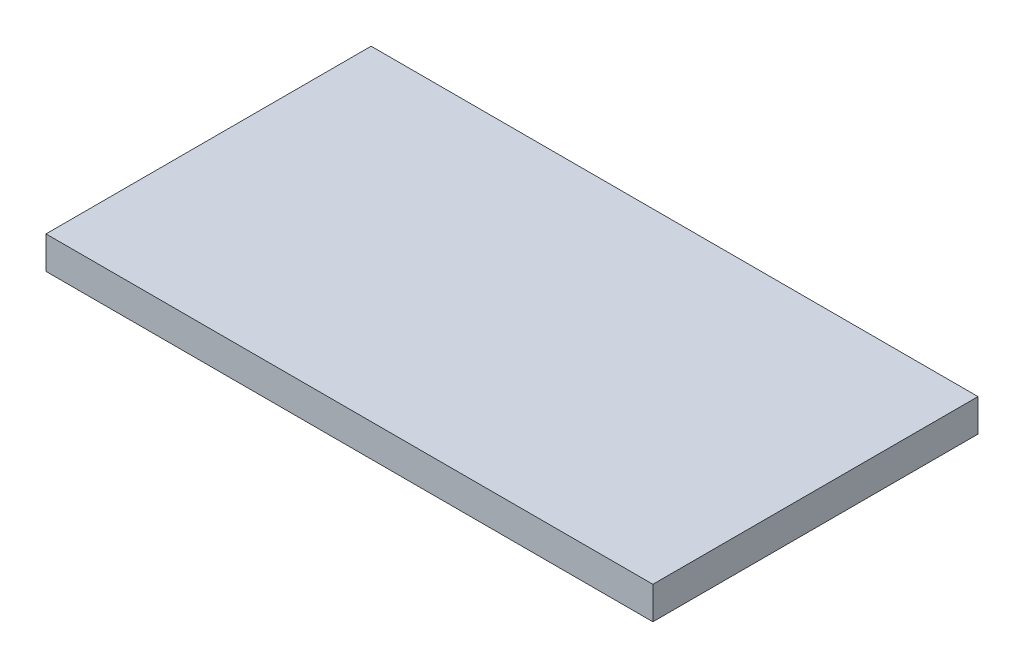
ISO-10303-21;
HEADER;
FILE_DESCRIPTION(('STEP AP214'),'2;1');
FILE_NAME('part.step','',(''),(''),'','','');
FILE_SCHEMA(('AUTOMOTIVE_DESIGN { 1 0 10303 214 1 1 1 1 }'));
ENDSEC;
DATA;
#1=APPLICATION_CONTEXT('core data for automotive mechanical design processes');
#2=APPLICATION_PROTOCOL_DEFINITION('international standard','automotive_design',2000,#1);
#3=PRODUCT_CONTEXT('',#1,'mechanical');
#4=PRODUCT('Part','Part','',(#3));
#5=PRODUCT_RELATED_PRODUCT_CATEGORY('part','',(#4));
#6=PRODUCT_DEFINITION_FORMATION('','',#4);
#7=PRODUCT_DEFINITION_CONTEXT('part definition',#1,'design');
#8=PRODUCT_DEFINITION('design','',#6,#7);
#9=PRODUCT_DEFINITION_SHAPE('','',#8);
#10=(LENGTH_UNIT() NAMED_UNIT(*) SI_UNIT(.MILLI.,.METRE.));
#11=(NAMED_UNIT(*) PLANE_ANGLE_UNIT() SI_UNIT($,.RADIAN.));
#12=(NAMED_UNIT(*) SI_UNIT($,.STERADIAN.) SOLID_ANGLE_UNIT());
#13=UNCERTAINTY_MEASURE_WITH_UNIT(LENGTH_MEASURE(1.E-05),#10,'distance_accuracy_value','');
#14=(GEOMETRIC_REPRESENTATION_CONTEXT(3) GLOBAL_UNCERTAINTY_ASSIGNED_CONTEXT((#13)) GLOBAL_UNIT_ASSIGNED_CONTEXT((#10,
#11,#12)) REPRESENTATION_CONTEXT('',''));
#15=CARTESIAN_POINT('',(0.,0.,0.));
#16=DIRECTION('',(0.,0.,1.));
#17=DIRECTION('',(1.,0.,0.));
#18=AXIS2_PLACEMENT_3D('',#15,#16,#17);
#19=CARTESIAN_POINT('',(0.,76.2,0.));
#20=DIRECTION('',(1.,0.,0.));
#21=DIRECTION('',(0.,0.,-1.));
#22=AXIS2_PLACEMENT_3D('',#19,#20,#21);
#23=PLANE('',#22);
#24=DIRECTION('',(0.,0.,1.));
#25=VECTOR('',#24,1.);
#26=CARTESIAN_POINT('',(0.,0.,0.));
#27=LINE('',#26,#25);
#28=CARTESIAN_POINT('',(0.,0.,-762.));
#29=VERTEX_POINT('',#28);
#30=CARTESIAN_POINT('',(0.,0.,0.));
#31=VERTEX_POINT('',#30);
#32=EDGE_CURVE('E345',#29,#31,#27,.T.);
#33=ORIENTED_EDGE('',*,*,#32,.T.);
#34=DIRECTION('',(0.,-1.,0.));
#35=VECTOR('',#34,1.);
#36=CARTESIAN_POINT('',(0.,76.2,0.));
#37=LINE('',#36,#35);
#38=CARTESIAN_POINT('',(0.,76.2,0.));
#39=VERTEX_POINT('',#38);
#40=EDGE_CURVE('E11',#39,#31,#37,.T.);
#41=ORIENTED_EDGE('',*,*,#40,.F.);
#42=DIRECTION('',(0.,0.,1.));
#43=VECTOR('',#42,1.);
#44=CARTESIAN_POINT('',(0.,76.2,0.));
#45=LINE('',#44,#43);
#46=CARTESIAN_POINT('',(0.,76.2,-762.));
#47=VERTEX_POINT('',#46);
#48=EDGE_CURVE('E355',#47,#39,#45,.T.);
#49=ORIENTED_EDGE('',*,*,#48,.F.);
#50=DIRECTION('',(0.,-1.,0.));
#51=VECTOR('',#50,1.);
#52=CARTESIAN_POINT('',(0.,76.2,-762.));
#53=LINE('',#52,#51);
#54=EDGE_CURVE('E369',#47,#29,#53,.T.);
#55=ORIENTED_EDGE('',*,*,#54,.T.);
#56=EDGE_LOOP('',(#33,#41,#49,#55));
#57=FACE_BOUND('',#56,.T.);
#58=ADVANCED_FACE('F42',(#57),#23,.F.);
#59=CARTESIAN_POINT('',(0.,76.2,0.));
#60=DIRECTION('',(0.,0.,-1.));
#61=DIRECTION('',(-1.,0.,0.));
#62=AXIS2_PLACEMENT_3D('',#59,#60,#61);
#63=PLANE('',#62);
#64=DIRECTION('',(1.,0.,0.));
#65=VECTOR('',#64,1.);
#66=CARTESIAN_POINT('',(0.,0.,0.));
#67=LINE('',#66,#65);
#68=CARTESIAN_POINT('',(1422.4,0.,0.));
#69=VERTEX_POINT('',#68);
#70=EDGE_CURVE('E373',#31,#69,#67,.T.);
#71=ORIENTED_EDGE('',*,*,#70,.T.);
#72=DIRECTION('',(0.,-1.,0.));
#73=VECTOR('',#72,1.);
#74=CARTESIAN_POINT('',(1422.4,76.2,0.));
#75=LINE('',#74,#73);
#76=CARTESIAN_POINT('',(1422.4,76.2,0.));
#77=VERTEX_POINT('',#76);
#78=EDGE_CURVE('E50',#77,#69,#75,.T.);
#79=ORIENTED_EDGE('',*,*,#78,.F.);
#80=DIRECTION('',(1.,0.,0.));
#81=VECTOR('',#80,1.);
#82=CARTESIAN_POINT('',(0.,76.2,0.));
#83=LINE('',#82,#81);
#84=EDGE_CURVE('E359',#39,#77,#83,.T.);
#85=ORIENTED_EDGE('',*,*,#84,.F.);
#86=ORIENTED_EDGE('',*,*,#40,.T.);
#87=EDGE_LOOP('',(#71,#79,#85,#86));
#88=FACE_BOUND('',#87,.T.);
#89=ADVANCED_FACE('F408',(#88),#63,.F.);
#90=CARTESIAN_POINT('',(1422.4,76.2,0.));
#91=DIRECTION('',(-1.,0.,0.));
#92=DIRECTION('',(0.,0.,1.));
#93=AXIS2_PLACEMENT_3D('',#90,#91,#92);
#94=PLANE('',#93);
#95=DIRECTION('',(0.,0.,-1.));
#96=VECTOR('',#95,1.);
#97=CARTESIAN_POINT('',(1422.4,0.,0.));
#98=LINE('',#97,#96);
#99=CARTESIAN_POINT('',(1422.4,0.,-762.));
#100=VERTEX_POINT('',#99);
#101=EDGE_CURVE('E376',#69,#100,#98,.T.);
#102=ORIENTED_EDGE('',*,*,#101,.T.);
#103=DIRECTION('',(0.,-1.,0.));
#104=VECTOR('',#103,1.);
#105=CARTESIAN_POINT('',(1422.4,76.2,-762.));
#106=LINE('',#105,#104);
#107=CARTESIAN_POINT('',(1422.4,76.2,-762.));
#108=VERTEX_POINT('',#107);
#109=EDGE_CURVE('E384',#108,#100,#106,.T.);
#110=ORIENTED_EDGE('',*,*,#109,.F.);
#111=DIRECTION('',(0.,0.,-1.));
#112=VECTOR('',#111,1.);
#113=CARTESIAN_POINT('',(1422.4,76.2,0.));
#114=LINE('',#113,#112);
#115=EDGE_CURVE('E363',#77,#108,#114,.T.);
#116=ORIENTED_EDGE('',*,*,#115,.F.);
#117=ORIENTED_EDGE('',*,*,#78,.T.);
#118=EDGE_LOOP('',(#102,#110,#116,#117));
#119=FACE_BOUND('',#118,.T.);
#120=ADVANCED_FACE('F393',(#119),#94,.F.);
#121=CARTESIAN_POINT('',(0.,76.2,-762.));
#122=DIRECTION('',(0.,0.,1.));
#123=DIRECTION('',(1.,0.,0.));
#124=AXIS2_PLACEMENT_3D('',#121,#122,#123);
#125=PLANE('',#124);
#126=DIRECTION('',(-1.,0.,0.));
#127=VECTOR('',#126,1.);
#128=CARTESIAN_POINT('',(0.,0.,-762.));
#129=LINE('',#128,#127);
#130=EDGE_CURVE('E360',#100,#29,#129,.T.);
#131=ORIENTED_EDGE('',*,*,#130,.T.);
#132=ORIENTED_EDGE('',*,*,#54,.F.);
#133=DIRECTION('',(-1.,0.,0.));
#134=VECTOR('',#133,1.);
#135=CARTESIAN_POINT('',(0.,76.2,-762.));
#136=LINE('',#135,#134);
#137=EDGE_CURVE('E366',#108,#47,#136,.T.);
#138=ORIENTED_EDGE('',*,*,#137,.F.);
#139=ORIENTED_EDGE('',*,*,#109,.T.);
#140=EDGE_LOOP('',(#131,#132,#138,#139));
#141=FACE_BOUND('',#140,.T.);
#142=ADVANCED_FACE('F401',(#141),#125,.F.);
#143=CARTESIAN_POINT('',(0.,76.2,0.));
#144=DIRECTION('',(0.,-1.,0.));
#145=DIRECTION('',(0.,0.,-1.));
#146=AXIS2_PLACEMENT_3D('',#143,#144,#145);
#147=PLANE('',#146);
#148=ORIENTED_EDGE('',*,*,#48,.T.);
#149=ORIENTED_EDGE('',*,*,#84,.T.);
#150=ORIENTED_EDGE('',*,*,#115,.T.);
#151=ORIENTED_EDGE('',*,*,#137,.T.);
#152=EDGE_LOOP('',(#148,#149,#150,#151));
#153=FACE_BOUND('',#152,.T.);
#154=ADVANCED_FACE('F407',(#153),#147,.F.);
#155=CARTESIAN_POINT('',(0.,0.,0.));
#156=DIRECTION('',(0.,-1.,0.));
#157=DIRECTION('',(0.,0.,-1.));
#158=AXIS2_PLACEMENT_3D('',#155,#156,#157);
#159=PLANE('',#158);
#160=DIRECTION('',(0.,0.,-1.));
#161=VECTOR('',#160,1.);
#162=CARTESIAN_POINT('',(101.6,0.,-609.6));
#163=LINE('',#162,#161);
#164=CARTESIAN_POINT('',(101.6,0.,-609.6));
#165=VERTEX_POINT('',#164);
#166=CARTESIAN_POINT('',(101.6,0.,-711.2));
#167=VERTEX_POINT('',#166);
#168=EDGE_CURVE('E57',#165,#167,#163,.T.);
#169=ORIENTED_EDGE('',*,*,#168,.F.);
#170=DIRECTION('',(-1.,0.,0.));
#171=VECTOR('',#170,1.);
#172=CARTESIAN_POINT('',(101.6,0.,-609.6));
#173=LINE('',#172,#171);
#174=CARTESIAN_POINT('',(203.2,0.,-609.6));
#175=VERTEX_POINT('',#174);
#176=EDGE_CURVE('E243',#175,#165,#173,.T.);
#177=ORIENTED_EDGE('',*,*,#176,.F.);
#178=DIRECTION('',(0.,0.,1.));
#179=VECTOR('',#178,1.);
#180=CARTESIAN_POINT('',(203.2,0.,-609.6));
#181=LINE('',#180,#179);
#182=CARTESIAN_POINT('',(203.2,0.,-711.2));
#183=VERTEX_POINT('',#182);
#184=EDGE_CURVE('E247',#183,#175,#181,.T.);
#185=ORIENTED_EDGE('',*,*,#184,.F.);
#186=DIRECTION('',(1.,0.,0.));
#187=VECTOR('',#186,1.);
#188=CARTESIAN_POINT('',(101.6,0.,-711.2));
#189=LINE('',#188,#187);
#190=EDGE_CURVE('E252',#167,#183,#189,.T.);
#191=ORIENTED_EDGE('',*,*,#190,.F.);
#192=EDGE_LOOP('',(#169,#177,#185,#191));
#193=FACE_BOUND('',#192,.T.);
#194=DIRECTION('',(0.,0.,-1.));
#195=VECTOR('',#194,1.);
#196=CARTESIAN_POINT('',(1219.2,0.,-50.8));
#197=LINE('',#196,#195);
#198=CARTESIAN_POINT('',(1219.2,0.,-50.8));
#199=VERTEX_POINT('',#198);
#200=CARTESIAN_POINT('',(1219.2,0.,-152.4));
#201=VERTEX_POINT('',#200);
#202=EDGE_CURVE('E65',#199,#201,#197,.T.);
#203=ORIENTED_EDGE('',*,*,#202,.F.);
#204=DIRECTION('',(-1.,0.,0.));
#205=VECTOR('',#204,1.);
#206=CARTESIAN_POINT('',(1219.2,0.,-50.8));
#207=LINE('',#206,#205);
#208=CARTESIAN_POINT('',(1320.8,0.,-50.8));
#209=VERTEX_POINT('',#208);
#210=EDGE_CURVE('E282',#209,#199,#207,.T.);
#211=ORIENTED_EDGE('',*,*,#210,.F.);
#212=DIRECTION('',(0.,0.,1.));
#213=VECTOR('',#212,1.);
#214=CARTESIAN_POINT('',(1320.8,0.,-50.8));
#215=LINE('',#214,#213);
#216=CARTESIAN_POINT('',(1320.8,0.,-152.4));
#217=VERTEX_POINT('',#216);
#218=EDGE_CURVE('E286',#217,#209,#215,.T.);
#219=ORIENTED_EDGE('',*,*,#218,.F.);
#220=DIRECTION('',(1.,0.,0.));
#221=VECTOR('',#220,1.);
#222=CARTESIAN_POINT('',(1219.2,0.,-152.4));
#223=LINE('',#222,#221);
#224=EDGE_CURVE('E291',#201,#217,#223,.T.);
#225=ORIENTED_EDGE('',*,*,#224,.F.);
#226=EDGE_LOOP('',(#203,#211,#219,#225));
#227=FACE_BOUND('',#226,.T.);
#228=DIRECTION('',(0.,0.,-1.));
#229=VECTOR('',#228,1.);
#230=CARTESIAN_POINT('',(1219.2,0.,-609.6));
#231=LINE('',#230,#229);
#232=CARTESIAN_POINT('',(1219.2,0.,-609.6));
#233=VERTEX_POINT('',#232);
#234=CARTESIAN_POINT('',(1219.2,0.,-711.2));
#235=VERTEX_POINT('',#234);
#236=EDGE_CURVE('E182',#233,#235,#231,.T.);
#237=ORIENTED_EDGE('',*,*,#236,.F.);
#238=DIRECTION('',(-1.,0.,0.));
#239=VECTOR('',#238,1.);
#240=CARTESIAN_POINT('',(1219.2,0.,-609.6));
#241=LINE('',#240,#239);
#242=CARTESIAN_POINT('',(1320.8,0.,-609.6));
#243=VERTEX_POINT('',#242);
#244=EDGE_CURVE('E193',#243,#233,#241,.T.);
#245=ORIENTED_EDGE('',*,*,#244,.F.);
#246=DIRECTION('',(0.,0.,1.));
#247=VECTOR('',#246,1.);
#248=CARTESIAN_POINT('',(1320.8,0.,-609.6));
#249=LINE('',#248,#247);
#250=CARTESIAN_POINT('',(1320.8,0.,-711.2));
#251=VERTEX_POINT('',#250);
#252=EDGE_CURVE('E199',#251,#243,#249,.T.);
#253=ORIENTED_EDGE('',*,*,#252,.F.);
#254=DIRECTION('',(1.,0.,0.));
#255=VECTOR('',#254,1.);
#256=CARTESIAN_POINT('',(1219.2,0.,-711.2));
#257=LINE('',#256,#255);
#258=EDGE_CURVE('E205',#235,#251,#257,.T.);
#259=ORIENTED_EDGE('',*,*,#258,.F.);
#260=EDGE_LOOP('',(#237,#245,#253,#259));
#261=FACE_BOUND('',#260,.T.);
#262=DIRECTION('',(0.,0.,-1.));
#263=VECTOR('',#262,1.);
#264=CARTESIAN_POINT('',(101.6,0.,-152.4));
#265=LINE('',#264,#263);
#266=CARTESIAN_POINT('',(101.6,0.,-50.8));
#267=VERTEX_POINT('',#266);
#268=CARTESIAN_POINT('',(101.6,0.,-152.4));
#269=VERTEX_POINT('',#268);
#270=EDGE_CURVE('E258',#267,#269,#265,.T.);
#271=ORIENTED_EDGE('',*,*,#270,.F.);
#272=DIRECTION('',(-1.,0.,0.));
#273=VECTOR('',#272,1.);
#274=CARTESIAN_POINT('',(101.6,0.,-50.8));
#275=LINE('',#274,#273);
#276=CARTESIAN_POINT('',(203.2,0.,-50.8));
#277=VERTEX_POINT('',#276);
#278=EDGE_CURVE('E316',#277,#267,#275,.T.);
#279=ORIENTED_EDGE('',*,*,#278,.F.);
#280=DIRECTION('',(0.,0.,1.));
#281=VECTOR('',#280,1.);
#282=CARTESIAN_POINT('',(203.2,0.,-152.4));
#283=LINE('',#282,#281);
#284=CARTESIAN_POINT('',(203.2,0.,-152.4));
#285=VERTEX_POINT('',#284);
#286=EDGE_CURVE('E335',#285,#277,#283,.T.);
#287=ORIENTED_EDGE('',*,*,#286,.F.);
#288=DIRECTION('',(1.,0.,0.));
#289=VECTOR('',#288,1.);
#290=CARTESIAN_POINT('',(101.6,0.,-152.4));
#291=LINE('',#290,#289);
#292=EDGE_CURVE('E331',#269,#285,#291,.T.);
#293=ORIENTED_EDGE('',*,*,#292,.F.);
#294=EDGE_LOOP('',(#271,#279,#287,#293));
#295=FACE_BOUND('',#294,.T.);
#296=ORIENTED_EDGE('',*,*,#32,.F.);
#297=ORIENTED_EDGE('',*,*,#130,.F.);
#298=ORIENTED_EDGE('',*,*,#101,.F.);
#299=ORIENTED_EDGE('',*,*,#70,.F.);
#300=EDGE_LOOP('',(#296,#297,#298,#299));
#301=FACE_BOUND('',#300,.T.);
#302=ADVANCED_FACE('F202',(#193,#227,#261,#295,#301),#159,.T.);
#303=CARTESIAN_POINT('',(101.6,38.1,-152.4));
#304=DIRECTION('',(-1.,0.,0.));
#305=DIRECTION('',(0.,0.,1.));
#306=AXIS2_PLACEMENT_3D('',#303,#304,#305);
#307=PLANE('',#306);
#308=ORIENTED_EDGE('',*,*,#270,.T.);
#309=DIRECTION('',(0.,-1.,0.));
#310=VECTOR('',#309,1.);
#311=CARTESIAN_POINT('',(101.6,38.1,-152.4));
#312=LINE('',#311,#310);
#313=CARTESIAN_POINT('',(101.6,38.1,-152.4));
#314=VERTEX_POINT('',#313);
#315=EDGE_CURVE('E328',#314,#269,#312,.T.);
#316=ORIENTED_EDGE('',*,*,#315,.F.);
#317=DIRECTION('',(0.,0.,-1.));
#318=VECTOR('',#317,1.);
#319=CARTESIAN_POINT('',(101.6,38.1,-152.4));
#320=LINE('',#319,#318);
#321=CARTESIAN_POINT('',(101.6,38.1,-50.8));
#322=VERTEX_POINT('',#321);
#323=EDGE_CURVE('E311',#322,#314,#320,.T.);
#324=ORIENTED_EDGE('',*,*,#323,.F.);
#325=DIRECTION('',(0.,-1.,0.));
#326=VECTOR('',#325,1.);
#327=CARTESIAN_POINT('',(101.6,38.1,-50.8));
#328=LINE('',#327,#326);
#329=EDGE_CURVE('E342',#322,#267,#328,.T.);
#330=ORIENTED_EDGE('',*,*,#329,.T.);
#331=EDGE_LOOP('',(#308,#316,#324,#330));
#332=FACE_BOUND('',#331,.T.);
#333=ADVANCED_FACE('F420',(#332),#307,.F.);
#334=CARTESIAN_POINT('',(101.6,38.1,-50.8));
#335=DIRECTION('',(0.,0.,1.));
#336=DIRECTION('',(1.,0.,0.));
#337=AXIS2_PLACEMENT_3D('',#334,#335,#336);
#338=PLANE('',#337);
#339=ORIENTED_EDGE('',*,*,#278,.T.);
#340=ORIENTED_EDGE('',*,*,#329,.F.);
#341=DIRECTION('',(-1.,0.,0.));
#342=VECTOR('',#341,1.);
#343=CARTESIAN_POINT('',(101.6,38.1,-50.8));
#344=LINE('',#343,#342);
#345=CARTESIAN_POINT('',(203.2,38.1,-50.8));
#346=VERTEX_POINT('',#345);
#347=EDGE_CURVE('E324',#346,#322,#344,.T.);
#348=ORIENTED_EDGE('',*,*,#347,.F.);
#349=DIRECTION('',(0.,-1.,0.));
#350=VECTOR('',#349,1.);
#351=CARTESIAN_POINT('',(203.2,38.1,-50.8));
#352=LINE('',#351,#350);
#353=EDGE_CURVE('E346',#346,#277,#352,.T.);
#354=ORIENTED_EDGE('',*,*,#353,.T.);
#355=EDGE_LOOP('',(#339,#340,#348,#354));
#356=FACE_BOUND('',#355,.T.);
#357=ADVANCED_FACE('F426',(#356),#338,.F.);
#358=CARTESIAN_POINT('',(203.2,38.1,-152.4));
#359=DIRECTION('',(1.,0.,0.));
#360=DIRECTION('',(0.,0.,-1.));
#361=AXIS2_PLACEMENT_3D('',#358,#359,#360);
#362=PLANE('',#361);
#363=ORIENTED_EDGE('',*,*,#286,.T.);
#364=ORIENTED_EDGE('',*,*,#353,.F.);
#365=DIRECTION('',(0.,0.,1.));
#366=VECTOR('',#365,1.);
#367=CARTESIAN_POINT('',(203.2,38.1,-152.4));
#368=LINE('',#367,#366);
#369=CARTESIAN_POINT('',(203.2,38.1,-152.4));
#370=VERTEX_POINT('',#369);
#371=EDGE_CURVE('E320',#370,#346,#368,.T.);
#372=ORIENTED_EDGE('',*,*,#371,.F.);
#373=DIRECTION('',(0.,-1.,0.));
#374=VECTOR('',#373,1.);
#375=CARTESIAN_POINT('',(203.2,38.1,-152.4));
#376=LINE('',#375,#374);
#377=EDGE_CURVE('E349',#370,#285,#376,.T.);
#378=ORIENTED_EDGE('',*,*,#377,.T.);
#379=EDGE_LOOP('',(#363,#364,#372,#378));
#380=FACE_BOUND('',#379,.T.);
#381=ADVANCED_FACE('F432',(#380),#362,.F.);
#382=CARTESIAN_POINT('',(101.6,38.1,-152.4));
#383=DIRECTION('',(0.,0.,-1.));
#384=DIRECTION('',(-1.,0.,0.));
#385=AXIS2_PLACEMENT_3D('',#382,#383,#384);
#386=PLANE('',#385);
#387=ORIENTED_EDGE('',*,*,#292,.T.);
#388=ORIENTED_EDGE('',*,*,#377,.F.);
#389=DIRECTION('',(1.,0.,0.));
#390=VECTOR('',#389,1.);
#391=CARTESIAN_POINT('',(101.6,38.1,-152.4));
#392=LINE('',#391,#390);
#393=EDGE_CURVE('E315',#314,#370,#392,.T.);
#394=ORIENTED_EDGE('',*,*,#393,.F.);
#395=ORIENTED_EDGE('',*,*,#315,.T.);
#396=EDGE_LOOP('',(#387,#388,#394,#395));
#397=FACE_BOUND('',#396,.T.);
#398=ADVANCED_FACE('F428',(#397),#386,.F.);
#399=CARTESIAN_POINT('',(0.,38.1,0.));
#400=DIRECTION('',(0.,1.,0.));
#401=DIRECTION('',(0.,0.,1.));
#402=AXIS2_PLACEMENT_3D('',#399,#400,#401);
#403=PLANE('',#402);
#404=ORIENTED_EDGE('',*,*,#323,.T.);
#405=ORIENTED_EDGE('',*,*,#393,.T.);
#406=ORIENTED_EDGE('',*,*,#371,.T.);
#407=ORIENTED_EDGE('',*,*,#347,.T.);
#408=EDGE_LOOP('',(#404,#405,#406,#407));
#409=FACE_BOUND('',#408,.T.);
#410=ADVANCED_FACE('F431',(#409),#403,.F.);
#411=CARTESIAN_POINT('',(1219.2,38.1,-609.6));
#412=DIRECTION('',(-1.,0.,0.));
#413=DIRECTION('',(0.,0.,1.));
#414=AXIS2_PLACEMENT_3D('',#411,#412,#413);
#415=PLANE('',#414);
#416=ORIENTED_EDGE('',*,*,#236,.T.);
#417=DIRECTION('',(0.,-1.,0.));
#418=VECTOR('',#417,1.);
#419=CARTESIAN_POINT('',(1219.2,38.1,-711.2));
#420=LINE('',#419,#418);
#421=CARTESIAN_POINT('',(1219.2,38.1,-711.2));
#422=VERTEX_POINT('',#421);
#423=EDGE_CURVE('E220',#422,#235,#420,.T.);
#424=ORIENTED_EDGE('',*,*,#423,.F.);
#425=DIRECTION('',(0.,0.,-1.));
#426=VECTOR('',#425,1.);
#427=CARTESIAN_POINT('',(1219.2,38.1,-609.6));
#428=LINE('',#427,#426);
#429=CARTESIAN_POINT('',(1219.2,38.1,-609.6));
#430=VERTEX_POINT('',#429);
#431=EDGE_CURVE('E185',#430,#422,#428,.T.);
#432=ORIENTED_EDGE('',*,*,#431,.F.);
#433=DIRECTION('',(0.,-1.,0.));
#434=VECTOR('',#433,1.);
#435=CARTESIAN_POINT('',(1219.2,38.1,-609.6));
#436=LINE('',#435,#434);
#437=EDGE_CURVE('E178',#430,#233,#436,.T.);
#438=ORIENTED_EDGE('',*,*,#437,.T.);
#439=EDGE_LOOP('',(#416,#424,#432,#438));
#440=FACE_BOUND('',#439,.T.);
#441=ADVANCED_FACE('F180',(#440),#415,.F.);
#442=CARTESIAN_POINT('',(1219.2,38.1,-609.6));
#443=DIRECTION('',(0.,0.,1.));
#444=DIRECTION('',(1.,0.,0.));
#445=AXIS2_PLACEMENT_3D('',#442,#443,#444);
#446=PLANE('',#445);
#447=ORIENTED_EDGE('',*,*,#244,.T.);
#448=ORIENTED_EDGE('',*,*,#437,.F.);
#449=DIRECTION('',(-1.,0.,0.));
#450=VECTOR('',#449,1.);
#451=CARTESIAN_POINT('',(1219.2,38.1,-609.6));
#452=LINE('',#451,#450);
#453=CARTESIAN_POINT('',(1320.8,38.1,-609.6));
#454=VERTEX_POINT('',#453);
#455=EDGE_CURVE('E216',#454,#430,#452,.T.);
#456=ORIENTED_EDGE('',*,*,#455,.F.);
#457=DIRECTION('',(0.,-1.,0.));
#458=VECTOR('',#457,1.);
#459=CARTESIAN_POINT('',(1320.8,38.1,-609.6));
#460=LINE('',#459,#458);
#461=EDGE_CURVE('E190',#454,#243,#460,.T.);
#462=ORIENTED_EDGE('',*,*,#461,.T.);
#463=EDGE_LOOP('',(#447,#448,#456,#462));
#464=FACE_BOUND('',#463,.T.);
#465=ADVANCED_FACE('F194',(#464),#446,.F.);
#466=CARTESIAN_POINT('',(1320.8,38.1,-609.6));
#467=DIRECTION('',(1.,0.,0.));
#468=DIRECTION('',(0.,0.,-1.));
#469=AXIS2_PLACEMENT_3D('',#466,#467,#468);
#470=PLANE('',#469);
#471=ORIENTED_EDGE('',*,*,#252,.T.);
#472=ORIENTED_EDGE('',*,*,#461,.F.);
#473=DIRECTION('',(0.,0.,1.));
#474=VECTOR('',#473,1.);
#475=CARTESIAN_POINT('',(1320.8,38.1,-609.6));
#476=LINE('',#475,#474);
#477=CARTESIAN_POINT('',(1320.8,38.1,-711.2));
#478=VERTEX_POINT('',#477);
#479=EDGE_CURVE('E219',#478,#454,#476,.T.);
#480=ORIENTED_EDGE('',*,*,#479,.F.);
#481=DIRECTION('',(0.,-1.,0.));
#482=VECTOR('',#481,1.);
#483=CARTESIAN_POINT('',(1320.8,38.1,-711.2));
#484=LINE('',#483,#482);
#485=EDGE_CURVE('E703',#478,#251,#484,.T.);
#486=ORIENTED_EDGE('',*,*,#485,.T.);
#487=EDGE_LOOP('',(#471,#472,#480,#486));
#488=FACE_BOUND('',#487,.T.);
#489=ADVANCED_FACE('F488',(#488),#470,.F.);
#490=CARTESIAN_POINT('',(1219.2,38.1,-711.2));
#491=DIRECTION('',(0.,0.,-1.));
#492=DIRECTION('',(-1.,0.,0.));
#493=AXIS2_PLACEMENT_3D('',#490,#491,#492);
#494=PLANE('',#493);
#495=ORIENTED_EDGE('',*,*,#258,.T.);
#496=ORIENTED_EDGE('',*,*,#485,.F.);
#497=DIRECTION('',(1.,0.,0.));
#498=VECTOR('',#497,1.);
#499=CARTESIAN_POINT('',(1219.2,38.1,-711.2));
#500=LINE('',#499,#498);
#501=EDGE_CURVE('E224',#422,#478,#500,.T.);
#502=ORIENTED_EDGE('',*,*,#501,.F.);
#503=ORIENTED_EDGE('',*,*,#423,.T.);
#504=EDGE_LOOP('',(#495,#496,#502,#503));
#505=FACE_BOUND('',#504,.T.);
#506=ADVANCED_FACE('F484',(#505),#494,.F.);
#507=CARTESIAN_POINT('',(0.,38.1,0.));
#508=DIRECTION('',(0.,-1.,0.));
#509=DIRECTION('',(0.,0.,-1.));
#510=AXIS2_PLACEMENT_3D('',#507,#508,#509);
#511=PLANE('',#510);
#512=ORIENTED_EDGE('',*,*,#431,.T.);
#513=ORIENTED_EDGE('',*,*,#501,.T.);
#514=ORIENTED_EDGE('',*,*,#479,.T.);
#515=ORIENTED_EDGE('',*,*,#455,.T.);
#516=EDGE_LOOP('',(#512,#513,#514,#515));
#517=FACE_BOUND('',#516,.T.);
#518=ADVANCED_FACE('F463',(#517),#511,.T.);
#519=CARTESIAN_POINT('',(1219.2,38.1,-50.8));
#520=DIRECTION('',(-1.,0.,0.));
#521=DIRECTION('',(0.,0.,1.));
#522=AXIS2_PLACEMENT_3D('',#519,#520,#521);
#523=PLANE('',#522);
#524=ORIENTED_EDGE('',*,*,#202,.T.);
#525=DIRECTION('',(0.,-1.,0.));
#526=VECTOR('',#525,1.);
#527=CARTESIAN_POINT('',(1219.2,38.1,-152.4));
#528=LINE('',#527,#526);
#529=CARTESIAN_POINT('',(1219.2,38.1,-152.4));
#530=VERTEX_POINT('',#529);
#531=EDGE_CURVE('E273',#530,#201,#528,.T.);
#532=ORIENTED_EDGE('',*,*,#531,.F.);
#533=DIRECTION('',(0.,0.,-1.));
#534=VECTOR('',#533,1.);
#535=CARTESIAN_POINT('',(1219.2,38.1,-50.8));
#536=LINE('',#535,#534);
#537=CARTESIAN_POINT('',(1219.2,38.1,-50.8));
#538=VERTEX_POINT('',#537);
#539=EDGE_CURVE('E287',#538,#530,#536,.T.);
#540=ORIENTED_EDGE('',*,*,#539,.F.);
#541=DIRECTION('',(0.,-1.,0.));
#542=VECTOR('',#541,1.);
#543=CARTESIAN_POINT('',(1219.2,38.1,-50.8));
#544=LINE('',#543,#542);
#545=EDGE_CURVE('E207',#538,#199,#544,.T.);
#546=ORIENTED_EDGE('',*,*,#545,.T.);
#547=EDGE_LOOP('',(#524,#532,#540,#546));
#548=FACE_BOUND('',#547,.T.);
#549=ADVANCED_FACE('F453',(#548),#523,.F.);
#550=CARTESIAN_POINT('',(1219.2,38.1,-50.8));
#551=DIRECTION('',(0.,0.,1.));
#552=DIRECTION('',(1.,0.,0.));
#553=AXIS2_PLACEMENT_3D('',#550,#551,#552);
#554=PLANE('',#553);
#555=ORIENTED_EDGE('',*,*,#210,.T.);
#556=ORIENTED_EDGE('',*,*,#545,.F.);
#557=DIRECTION('',(-1.,0.,0.));
#558=VECTOR('',#557,1.);
#559=CARTESIAN_POINT('',(1219.2,38.1,-50.8));
#560=LINE('',#559,#558);
#561=CARTESIAN_POINT('',(1320.8,38.1,-50.8));
#562=VERTEX_POINT('',#561);
#563=EDGE_CURVE('E276',#562,#538,#560,.T.);
#564=ORIENTED_EDGE('',*,*,#563,.F.);
#565=DIRECTION('',(0.,-1.,0.));
#566=VECTOR('',#565,1.);
#567=CARTESIAN_POINT('',(1320.8,38.1,-50.8));
#568=LINE('',#567,#566);
#569=EDGE_CURVE('E211',#562,#209,#568,.T.);
#570=ORIENTED_EDGE('',*,*,#569,.T.);
#571=EDGE_LOOP('',(#555,#556,#564,#570));
#572=FACE_BOUND('',#571,.T.);
#573=ADVANCED_FACE('F449',(#572),#554,.F.);
#574=CARTESIAN_POINT('',(1320.8,38.1,-50.8));
#575=DIRECTION('',(1.,0.,0.));
#576=DIRECTION('',(0.,0.,-1.));
#577=AXIS2_PLACEMENT_3D('',#574,#575,#576);
#578=PLANE('',#577);
#579=ORIENTED_EDGE('',*,*,#218,.T.);
#580=ORIENTED_EDGE('',*,*,#569,.F.);
#581=DIRECTION('',(0.,0.,1.));
#582=VECTOR('',#581,1.);
#583=CARTESIAN_POINT('',(1320.8,38.1,-50.8));
#584=LINE('',#583,#582);
#585=CARTESIAN_POINT('',(1320.8,38.1,-152.4));
#586=VERTEX_POINT('',#585);
#587=EDGE_CURVE('E300',#586,#562,#584,.T.);
#588=ORIENTED_EDGE('',*,*,#587,.F.);
#589=DIRECTION('',(0.,-1.,0.));
#590=VECTOR('',#589,1.);
#591=CARTESIAN_POINT('',(1320.8,38.1,-152.4));
#592=LINE('',#591,#590);
#593=EDGE_CURVE('E277',#586,#217,#592,.T.);
#594=ORIENTED_EDGE('',*,*,#593,.T.);
#595=EDGE_LOOP('',(#579,#580,#588,#594));
#596=FACE_BOUND('',#595,.T.);
#597=ADVANCED_FACE('F452',(#596),#578,.F.);
#598=CARTESIAN_POINT('',(1219.2,38.1,-152.4));
#599=DIRECTION('',(0.,0.,-1.));
#600=DIRECTION('',(-1.,0.,0.));
#601=AXIS2_PLACEMENT_3D('',#598,#599,#600);
#602=PLANE('',#601);
#603=ORIENTED_EDGE('',*,*,#224,.T.);
#604=ORIENTED_EDGE('',*,*,#593,.F.);
#605=DIRECTION('',(1.,0.,0.));
#606=VECTOR('',#605,1.);
#607=CARTESIAN_POINT('',(1219.2,38.1,-152.4));
#608=LINE('',#607,#606);
#609=EDGE_CURVE('E304',#530,#586,#608,.T.);
#610=ORIENTED_EDGE('',*,*,#609,.F.);
#611=ORIENTED_EDGE('',*,*,#531,.T.);
#612=EDGE_LOOP('',(#603,#604,#610,#611));
#613=FACE_BOUND('',#612,.T.);
#614=ADVANCED_FACE('F447',(#613),#602,.F.);
#615=CARTESIAN_POINT('',(0.,38.1,0.));
#616=DIRECTION('',(0.,-1.,0.));
#617=DIRECTION('',(0.,0.,-1.));
#618=AXIS2_PLACEMENT_3D('',#615,#616,#617);
#619=PLANE('',#618);
#620=ORIENTED_EDGE('',*,*,#539,.T.);
#621=ORIENTED_EDGE('',*,*,#609,.T.);
#622=ORIENTED_EDGE('',*,*,#587,.T.);
#623=ORIENTED_EDGE('',*,*,#563,.T.);
#624=EDGE_LOOP('',(#620,#621,#622,#623));
#625=FACE_BOUND('',#624,.T.);
#626=ADVANCED_FACE('F443',(#625),#619,.T.);
#627=CARTESIAN_POINT('',(101.6,38.1,-609.6));
#628=DIRECTION('',(-1.,0.,0.));
#629=DIRECTION('',(0.,0.,1.));
#630=AXIS2_PLACEMENT_3D('',#627,#628,#629);
#631=PLANE('',#630);
#632=ORIENTED_EDGE('',*,*,#168,.T.);
#633=DIRECTION('',(0.,-1.,0.));
#634=VECTOR('',#633,1.);
#635=CARTESIAN_POINT('',(101.6,38.1,-711.2));
#636=LINE('',#635,#634);
#637=CARTESIAN_POINT('',(101.6,38.1,-711.2));
#638=VERTEX_POINT('',#637);
#639=EDGE_CURVE('E230',#638,#167,#636,.T.);
#640=ORIENTED_EDGE('',*,*,#639,.F.);
#641=DIRECTION('',(0.,0.,-1.));
#642=VECTOR('',#641,1.);
#643=CARTESIAN_POINT('',(101.6,38.1,-609.6));
#644=LINE('',#643,#642);
#645=CARTESIAN_POINT('',(101.6,38.1,-609.6));
#646=VERTEX_POINT('',#645);
#647=EDGE_CURVE('E248',#646,#638,#644,.T.);
#648=ORIENTED_EDGE('',*,*,#647,.F.);
#649=DIRECTION('',(0.,-1.,0.));
#650=VECTOR('',#649,1.);
#651=CARTESIAN_POINT('',(101.6,38.1,-609.6));
#652=LINE('',#651,#650);
#653=EDGE_CURVE('E240',#646,#165,#652,.T.);
#654=ORIENTED_EDGE('',*,*,#653,.T.);
#655=EDGE_LOOP('',(#632,#640,#648,#654));
#656=FACE_BOUND('',#655,.T.);
#657=ADVANCED_FACE('F446',(#656),#631,.F.);
#658=CARTESIAN_POINT('',(101.6,38.1,-609.6));
#659=DIRECTION('',(0.,0.,1.));
#660=DIRECTION('',(1.,0.,0.));
#661=AXIS2_PLACEMENT_3D('',#658,#659,#660);
#662=PLANE('',#661);
#663=ORIENTED_EDGE('',*,*,#176,.T.);
#664=ORIENTED_EDGE('',*,*,#653,.F.);
#665=DIRECTION('',(-1.,0.,0.));
#666=VECTOR('',#665,1.);
#667=CARTESIAN_POINT('',(101.6,38.1,-609.6));
#668=LINE('',#667,#666);
#669=CARTESIAN_POINT('',(203.2,38.1,-609.6));
#670=VERTEX_POINT('',#669);
#671=EDGE_CURVE('E233',#670,#646,#668,.T.);
#672=ORIENTED_EDGE('',*,*,#671,.F.);
#673=DIRECTION('',(0.,-1.,0.));
#674=VECTOR('',#673,1.);
#675=CARTESIAN_POINT('',(203.2,38.1,-609.6));
#676=LINE('',#675,#674);
#677=EDGE_CURVE('E237',#670,#175,#676,.T.);
#678=ORIENTED_EDGE('',*,*,#677,.T.);
#679=EDGE_LOOP('',(#663,#664,#672,#678));
#680=FACE_BOUND('',#679,.T.);
#681=ADVANCED_FACE('F469',(#680),#662,.F.);
#682=CARTESIAN_POINT('',(203.2,38.1,-609.6));
#683=DIRECTION('',(1.,0.,0.));
#684=DIRECTION('',(0.,0.,-1.));
#685=AXIS2_PLACEMENT_3D('',#682,#683,#684);
#686=PLANE('',#685);
#687=ORIENTED_EDGE('',*,*,#184,.T.);
#688=ORIENTED_EDGE('',*,*,#677,.F.);
#689=DIRECTION('',(0.,0.,1.));
#690=VECTOR('',#689,1.);
#691=CARTESIAN_POINT('',(203.2,38.1,-609.6));
#692=LINE('',#691,#690);
#693=CARTESIAN_POINT('',(203.2,38.1,-711.2));
#694=VERTEX_POINT('',#693);
#695=EDGE_CURVE('E262',#694,#670,#692,.T.);
#696=ORIENTED_EDGE('',*,*,#695,.F.);
#697=DIRECTION('',(0.,-1.,0.));
#698=VECTOR('',#697,1.);
#699=CARTESIAN_POINT('',(203.2,38.1,-711.2));
#700=LINE('',#699,#698);
#701=EDGE_CURVE('E234',#694,#183,#700,.T.);
#702=ORIENTED_EDGE('',*,*,#701,.T.);
#703=EDGE_LOOP('',(#687,#688,#696,#702));
#704=FACE_BOUND('',#703,.T.);
#705=ADVANCED_FACE('F472',(#704),#686,.F.);
#706=CARTESIAN_POINT('',(101.6,38.1,-711.2));
#707=DIRECTION('',(0.,0.,-1.));
#708=DIRECTION('',(-1.,0.,0.));
#709=AXIS2_PLACEMENT_3D('',#706,#707,#708);
#710=PLANE('',#709);
#711=ORIENTED_EDGE('',*,*,#190,.T.);
#712=ORIENTED_EDGE('',*,*,#701,.F.);
#713=DIRECTION('',(1.,0.,0.));
#714=VECTOR('',#713,1.);
#715=CARTESIAN_POINT('',(101.6,38.1,-711.2));
#716=LINE('',#715,#714);
#717=EDGE_CURVE('E266',#638,#694,#716,.T.);
#718=ORIENTED_EDGE('',*,*,#717,.F.);
#719=ORIENTED_EDGE('',*,*,#639,.T.);
#720=EDGE_LOOP('',(#711,#712,#718,#719));
#721=FACE_BOUND('',#720,.T.);
#722=ADVANCED_FACE('F467',(#721),#710,.F.);
#723=CARTESIAN_POINT('',(0.,38.1,0.));
#724=DIRECTION('',(0.,-1.,0.));
#725=DIRECTION('',(0.,0.,-1.));
#726=AXIS2_PLACEMENT_3D('',#723,#724,#725);
#727=PLANE('',#726);
#728=ORIENTED_EDGE('',*,*,#647,.T.);
#729=ORIENTED_EDGE('',*,*,#717,.T.);
#730=ORIENTED_EDGE('',*,*,#695,.T.);
#731=ORIENTED_EDGE('',*,*,#671,.T.);
#732=EDGE_LOOP('',(#728,#729,#730,#731));
#733=FACE_BOUND('',#732,.T.);
#734=ADVANCED_FACE('F464',(#733),#727,.T.);
#735=CLOSED_SHELL('',(#58,#89,#120,#142,#154,#302,#333,#357,#381,#398,#410,#441,#465,#489,#506,
#518,#549,#573,#597,#614,#626,#657,#681,#705,#722,#734));
#736=MANIFOLD_SOLID_BREP('B2',#735);
#737=ADVANCED_BREP_SHAPE_REPRESENTATION('',(#18,#736),#14);
#738=SHAPE_DEFINITION_REPRESENTATION(#9,#737);
ENDSEC;
END-ISO-10303-21;
